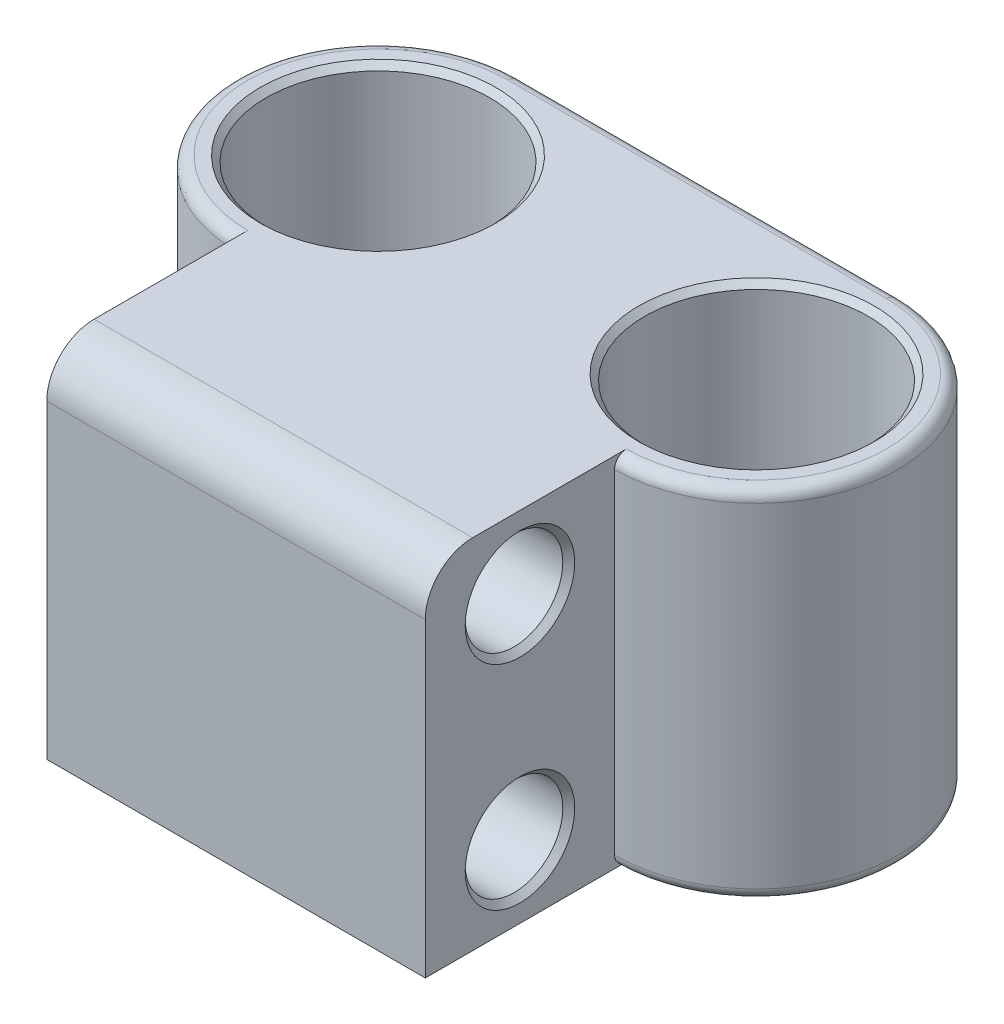
ISO-10303-21;
HEADER;
FILE_DESCRIPTION(('STEP AP214'),'2;1');
FILE_NAME('part.step','',(''),(''),'','','');
FILE_SCHEMA(('AUTOMOTIVE_DESIGN { 1 0 10303 214 1 1 1 1 }'));
ENDSEC;
DATA;
#1=APPLICATION_CONTEXT('core data for automotive mechanical design processes');
#2=APPLICATION_PROTOCOL_DEFINITION('international standard','automotive_design',2000,#1);
#3=PRODUCT_CONTEXT('',#1,'mechanical');
#4=PRODUCT('Part','Part','',(#3));
#5=PRODUCT_RELATED_PRODUCT_CATEGORY('part','',(#4));
#6=PRODUCT_DEFINITION_FORMATION('','',#4);
#7=PRODUCT_DEFINITION_CONTEXT('part definition',#1,'design');
#8=PRODUCT_DEFINITION('design','',#6,#7);
#9=PRODUCT_DEFINITION_SHAPE('','',#8);
#10=(LENGTH_UNIT() NAMED_UNIT(*) SI_UNIT(.MILLI.,.METRE.));
#11=(NAMED_UNIT(*) PLANE_ANGLE_UNIT() SI_UNIT($,.RADIAN.));
#12=(NAMED_UNIT(*) SI_UNIT($,.STERADIAN.) SOLID_ANGLE_UNIT());
#13=UNCERTAINTY_MEASURE_WITH_UNIT(LENGTH_MEASURE(1.E-05),#10,'distance_accuracy_value','');
#14=(GEOMETRIC_REPRESENTATION_CONTEXT(3) GLOBAL_UNCERTAINTY_ASSIGNED_CONTEXT((#13)) GLOBAL_UNIT_ASSIGNED_CONTEXT((#10,
#11,#12)) REPRESENTATION_CONTEXT('',''));
#15=CARTESIAN_POINT('',(0.,0.,0.));
#16=DIRECTION('',(0.,0.,1.));
#17=DIRECTION('',(1.,0.,0.));
#18=AXIS2_PLACEMENT_3D('',#15,#16,#17);
#19=CARTESIAN_POINT('',(-12.7,24.,-15.875));
#20=DIRECTION('',(0.,1.,0.));
#21=DIRECTION('',(0.,0.,1.));
#22=AXIS2_PLACEMENT_3D('',#19,#20,#21);
#23=PLANE('',#22);
#24=CARTESIAN_POINT('',(-12.7,24.,-15.875));
#25=DIRECTION('',(0.,1.,0.));
#26=DIRECTION('',(0.,0.,1.));
#27=AXIS2_PLACEMENT_3D('',#24,#25,#26);
#28=CIRCLE('',#27,7.90000000000001);
#29=CARTESIAN_POINT('',(-12.7,24.,-7.97499999999999));
#30=VERTEX_POINT('',#29);
#31=EDGE_CURVE('E180',#30,#30,#28,.F.);
#32=ORIENTED_EDGE('',*,*,#31,.T.);
#33=EDGE_LOOP('',(#32));
#34=FACE_BOUND('',#33,.T.);
#35=CARTESIAN_POINT('',(12.7,24.,-15.875));
#36=DIRECTION('',(0.,1.,0.));
#37=DIRECTION('',(0.,0.,1.));
#38=AXIS2_PLACEMENT_3D('',#35,#36,#37);
#39=CIRCLE('',#38,7.89999999999999);
#40=CARTESIAN_POINT('',(12.7,24.,-7.97500000000001));
#41=VERTEX_POINT('',#40);
#42=EDGE_CURVE('E177',#41,#41,#39,.F.);
#43=ORIENTED_EDGE('',*,*,#42,.T.);
#44=EDGE_LOOP('',(#43));
#45=FACE_BOUND('',#44,.T.);
#46=CARTESIAN_POINT('',(-12.7,24.,-15.875));
#47=DIRECTION('',(0.,1.,0.));
#48=DIRECTION('',(0.,0.,1.));
#49=AXIS2_PLACEMENT_3D('',#46,#47,#48);
#50=CIRCLE('',#49,8.73125);
#51=CARTESIAN_POINT('',(-12.7,24.,-24.60625));
#52=VERTEX_POINT('',#51);
#53=CARTESIAN_POINT('',(-12.7,24.,-7.14375));
#54=VERTEX_POINT('',#53);
#55=EDGE_CURVE('E219',#52,#54,#50,.T.);
#56=ORIENTED_EDGE('',*,*,#55,.T.);
#57=DIRECTION('',(0.,0.,1.));
#58=VECTOR('',#57,1.);
#59=CARTESIAN_POINT('',(-12.7,24.,6.35));
#60=LINE('',#59,#58);
#61=CARTESIAN_POINT('',(-12.7,24.,3.175));
#62=VERTEX_POINT('',#61);
#63=EDGE_CURVE('E144',#54,#62,#60,.T.);
#64=ORIENTED_EDGE('',*,*,#63,.T.);
#65=DIRECTION('',(1.,0.,0.));
#66=VECTOR('',#65,1.);
#67=CARTESIAN_POINT('',(12.7,24.,3.175));
#68=LINE('',#67,#66);
#69=CARTESIAN_POINT('',(12.7,24.,3.175));
#70=VERTEX_POINT('',#69);
#71=EDGE_CURVE('E183',#62,#70,#68,.T.);
#72=ORIENTED_EDGE('',*,*,#71,.T.);
#73=DIRECTION('',(0.,0.,-1.));
#74=VECTOR('',#73,1.);
#75=CARTESIAN_POINT('',(12.7,24.,6.35));
#76=LINE('',#75,#74);
#77=CARTESIAN_POINT('',(12.7,24.,-7.14375));
#78=VERTEX_POINT('',#77);
#79=EDGE_CURVE('E152',#70,#78,#76,.T.);
#80=ORIENTED_EDGE('',*,*,#79,.T.);
#81=CARTESIAN_POINT('',(12.7,24.,-15.875));
#82=DIRECTION('',(0.,1.,0.));
#83=DIRECTION('',(0.,0.,1.));
#84=AXIS2_PLACEMENT_3D('',#81,#82,#83);
#85=CIRCLE('',#84,8.73125);
#86=CARTESIAN_POINT('',(12.7,24.,-24.60625));
#87=VERTEX_POINT('',#86);
#88=EDGE_CURVE('E215',#78,#87,#85,.T.);
#89=ORIENTED_EDGE('',*,*,#88,.T.);
#90=DIRECTION('',(-1.,0.,0.));
#91=VECTOR('',#90,1.);
#92=CARTESIAN_POINT('',(-12.7,24.,-24.60625));
#93=LINE('',#92,#91);
#94=EDGE_CURVE('E217',#87,#52,#93,.T.);
#95=ORIENTED_EDGE('',*,*,#94,.T.);
#96=EDGE_LOOP('',(#56,#64,#72,#80,#89,#95));
#97=FACE_BOUND('',#96,.T.);
#98=ADVANCED_FACE('F33',(#34,#45,#97),#23,.T.);
#99=CARTESIAN_POINT('',(-12.7,0.,-15.875));
#100=DIRECTION('',(0.,1.,0.));
#101=DIRECTION('',(0.,0.,1.));
#102=AXIS2_PLACEMENT_3D('',#99,#100,#101);
#103=PLANE('',#102);
#104=CARTESIAN_POINT('',(12.7,0.,-15.875));
#105=DIRECTION('',(0.,1.,0.));
#106=DIRECTION('',(0.,0.,1.));
#107=AXIS2_PLACEMENT_3D('',#104,#105,#106);
#108=CIRCLE('',#107,7.89999999991048);
#109=CARTESIAN_POINT('',(12.7,0.,-7.97500000008953));
#110=VERTEX_POINT('',#109);
#111=EDGE_CURVE('E162',#110,#110,#108,.T.);
#112=ORIENTED_EDGE('',*,*,#111,.T.);
#113=EDGE_LOOP('',(#112));
#114=FACE_BOUND('',#113,.T.);
#115=CARTESIAN_POINT('',(-12.7,0.,-15.875));
#116=DIRECTION('',(0.,1.,0.));
#117=DIRECTION('',(0.,0.,1.));
#118=AXIS2_PLACEMENT_3D('',#115,#116,#117);
#119=CIRCLE('',#118,7.89999999991047);
#120=CARTESIAN_POINT('',(-12.7,0.,-7.97500000008953));
#121=VERTEX_POINT('',#120);
#122=EDGE_CURVE('E159',#121,#121,#119,.T.);
#123=ORIENTED_EDGE('',*,*,#122,.T.);
#124=EDGE_LOOP('',(#123));
#125=FACE_BOUND('',#124,.T.);
#126=DIRECTION('',(0.,0.,1.));
#127=VECTOR('',#126,1.);
#128=CARTESIAN_POINT('',(-12.7,0.,6.35));
#129=LINE('',#128,#127);
#130=CARTESIAN_POINT('',(-12.7,0.,-7.14375));
#131=VERTEX_POINT('',#130);
#132=CARTESIAN_POINT('',(-12.7,0.,6.35));
#133=VERTEX_POINT('',#132);
#134=EDGE_CURVE('E132',#131,#133,#129,.T.);
#135=ORIENTED_EDGE('',*,*,#134,.F.);
#136=CARTESIAN_POINT('',(-12.7,0.,-15.875));
#137=DIRECTION('',(0.,1.,0.));
#138=DIRECTION('',(0.,0.,1.));
#139=AXIS2_PLACEMENT_3D('',#136,#137,#138);
#140=CIRCLE('',#139,8.73125);
#141=CARTESIAN_POINT('',(-12.7,0.,-24.60625));
#142=VERTEX_POINT('',#141);
#143=EDGE_CURVE('E235',#131,#142,#140,.F.);
#144=ORIENTED_EDGE('',*,*,#143,.T.);
#145=DIRECTION('',(-1.,0.,0.));
#146=VECTOR('',#145,1.);
#147=CARTESIAN_POINT('',(-12.7,0.,-24.60625));
#148=LINE('',#147,#146);
#149=CARTESIAN_POINT('',(12.7,0.,-24.60625));
#150=VERTEX_POINT('',#149);
#151=EDGE_CURVE('E233',#142,#150,#148,.F.);
#152=ORIENTED_EDGE('',*,*,#151,.T.);
#153=CARTESIAN_POINT('',(12.7,0.,-15.875));
#154=DIRECTION('',(0.,1.,0.));
#155=DIRECTION('',(0.,0.,1.));
#156=AXIS2_PLACEMENT_3D('',#153,#154,#155);
#157=CIRCLE('',#156,8.73125);
#158=CARTESIAN_POINT('',(12.7,0.,-7.14375));
#159=VERTEX_POINT('',#158);
#160=EDGE_CURVE('E231',#150,#159,#157,.F.);
#161=ORIENTED_EDGE('',*,*,#160,.T.);
#162=DIRECTION('',(0.,0.,-1.));
#163=VECTOR('',#162,1.);
#164=CARTESIAN_POINT('',(12.7,0.,6.35));
#165=LINE('',#164,#163);
#166=CARTESIAN_POINT('',(12.7,0.,6.35));
#167=VERTEX_POINT('',#166);
#168=EDGE_CURVE('E142',#167,#159,#165,.T.);
#169=ORIENTED_EDGE('',*,*,#168,.F.);
#170=DIRECTION('',(1.,0.,0.));
#171=VECTOR('',#170,1.);
#172=CARTESIAN_POINT('',(12.7,0.,6.35));
#173=LINE('',#172,#171);
#174=EDGE_CURVE('E122',#133,#167,#173,.T.);
#175=ORIENTED_EDGE('',*,*,#174,.F.);
#176=EDGE_LOOP('',(#135,#144,#152,#161,#169,#175));
#177=FACE_BOUND('',#176,.T.);
#178=ADVANCED_FACE('F140',(#114,#125,#177),#103,.F.);
#179=CARTESIAN_POINT('',(-12.7,24.,-15.875));
#180=DIRECTION('',(0.,-1.,0.));
#181=DIRECTION('',(0.,0.,-1.));
#182=AXIS2_PLACEMENT_3D('',#179,#180,#181);
#183=CYLINDRICAL_SURFACE('',#182,9.525);
#184=DIRECTION('',(0.,-1.,0.));
#185=VECTOR('',#184,1.);
#186=CARTESIAN_POINT('',(-12.7,24.,-6.35));
#187=LINE('',#186,#185);
#188=CARTESIAN_POINT('',(-12.7,23.20625,-6.35));
#189=VERTEX_POINT('',#188);
#190=CARTESIAN_POINT('',(-12.7,0.793749999999999,-6.35));
#191=VERTEX_POINT('',#190);
#192=EDGE_CURVE('E128',#189,#191,#187,.T.);
#193=ORIENTED_EDGE('',*,*,#192,.F.);
#194=CARTESIAN_POINT('',(-12.7,23.20625,-15.875));
#195=DIRECTION('',(0.,1.,0.));
#196=DIRECTION('',(0.,0.,1.));
#197=AXIS2_PLACEMENT_3D('',#194,#195,#196);
#198=CIRCLE('',#197,9.525);
#199=CARTESIAN_POINT('',(-12.7,23.20625,-25.4));
#200=VERTEX_POINT('',#199);
#201=EDGE_CURVE('E225',#189,#200,#198,.F.);
#202=ORIENTED_EDGE('',*,*,#201,.T.);
#203=DIRECTION('',(0.,-1.,0.));
#204=VECTOR('',#203,1.);
#205=CARTESIAN_POINT('',(-12.7,24.,-25.4));
#206=LINE('',#205,#204);
#207=CARTESIAN_POINT('',(-12.7,0.793749999999999,-25.4));
#208=VERTEX_POINT('',#207);
#209=EDGE_CURVE('E148',#200,#208,#206,.T.);
#210=ORIENTED_EDGE('',*,*,#209,.T.);
#211=CARTESIAN_POINT('',(-12.7,0.793749999999999,-15.875));
#212=DIRECTION('',(0.,1.,0.));
#213=DIRECTION('',(0.,0.,1.));
#214=AXIS2_PLACEMENT_3D('',#211,#212,#213);
#215=CIRCLE('',#214,9.525);
#216=EDGE_CURVE('E222',#208,#191,#215,.T.);
#217=ORIENTED_EDGE('',*,*,#216,.T.);
#218=EDGE_LOOP('',(#193,#202,#210,#217));
#219=FACE_BOUND('',#218,.T.);
#220=ADVANCED_FACE('F266',(#219),#183,.T.);
#221=CARTESIAN_POINT('',(-12.7,24.,6.35));
#222=DIRECTION('',(1.,0.,0.));
#223=DIRECTION('',(0.,0.,-1.));
#224=AXIS2_PLACEMENT_3D('',#221,#222,#223);
#225=PLANE('',#224);
#226=CARTESIAN_POINT('',(-12.7,19.14375,0.));
#227=DIRECTION('',(1.,0.,0.));
#228=DIRECTION('',(0.,0.,-1.));
#229=AXIS2_PLACEMENT_3D('',#226,#227,#228);
#230=CIRCLE('',#229,3.67499999991047);
#231=CARTESIAN_POINT('',(-12.7,19.14375,-3.67499999991047));
#232=VERTEX_POINT('',#231);
#233=EDGE_CURVE('E212',#232,#232,#230,.T.);
#234=ORIENTED_EDGE('',*,*,#233,.T.);
#235=EDGE_LOOP('',(#234));
#236=FACE_BOUND('',#235,.T.);
#237=CARTESIAN_POINT('',(-12.7,4.85625,0.));
#238=DIRECTION('',(1.,0.,0.));
#239=DIRECTION('',(0.,0.,-1.));
#240=AXIS2_PLACEMENT_3D('',#237,#238,#239);
#241=CIRCLE('',#240,3.67499999991047);
#242=CARTESIAN_POINT('',(-12.7,4.85625,-3.67499999991047));
#243=VERTEX_POINT('',#242);
#244=EDGE_CURVE('E209',#243,#243,#241,.T.);
#245=ORIENTED_EDGE('',*,*,#244,.T.);
#246=EDGE_LOOP('',(#245));
#247=FACE_BOUND('',#246,.T.);
#248=DIRECTION('',(0.,-1.,0.));
#249=VECTOR('',#248,1.);
#250=CARTESIAN_POINT('',(-12.7,24.,6.35));
#251=LINE('',#250,#249);
#252=CARTESIAN_POINT('',(-12.7,20.825,6.35));
#253=VERTEX_POINT('',#252);
#254=EDGE_CURVE('E117',#253,#133,#251,.T.);
#255=ORIENTED_EDGE('',*,*,#254,.F.);
#256=CARTESIAN_POINT('',(-12.7,20.825,3.175));
#257=DIRECTION('',(1.,0.,0.));
#258=DIRECTION('',(0.,0.,-1.));
#259=AXIS2_PLACEMENT_3D('',#256,#257,#258);
#260=CIRCLE('',#259,3.175);
#261=EDGE_CURVE('E189',#253,#62,#260,.F.);
#262=ORIENTED_EDGE('',*,*,#261,.T.);
#263=ORIENTED_EDGE('',*,*,#63,.F.);
#264=CARTESIAN_POINT('',(-12.7,23.20625,-7.14375));
#265=DIRECTION('',(1.,0.,0.));
#266=DIRECTION('',(0.,0.,-1.));
#267=AXIS2_PLACEMENT_3D('',#264,#265,#266);
#268=CIRCLE('',#267,0.79375);
#269=EDGE_CURVE('E240',#54,#189,#268,.T.);
#270=ORIENTED_EDGE('',*,*,#269,.T.);
#271=ORIENTED_EDGE('',*,*,#192,.T.);
#272=CARTESIAN_POINT('',(-12.7,0.793749999999999,-7.14375));
#273=DIRECTION('',(1.,0.,0.));
#274=DIRECTION('',(0.,0.,-1.));
#275=AXIS2_PLACEMENT_3D('',#272,#273,#274);
#276=CIRCLE('',#275,0.79375);
#277=EDGE_CURVE('E135',#191,#131,#276,.T.);
#278=ORIENTED_EDGE('',*,*,#277,.T.);
#279=ORIENTED_EDGE('',*,*,#134,.T.);
#280=EDGE_LOOP('',(#255,#262,#263,#270,#271,#278,#279));
#281=FACE_BOUND('',#280,.T.);
#282=ADVANCED_FACE('F133',(#236,#247,#281),#225,.F.);
#283=CARTESIAN_POINT('',(12.7,24.,6.35));
#284=DIRECTION('',(0.,0.,-1.));
#285=DIRECTION('',(-1.,0.,0.));
#286=AXIS2_PLACEMENT_3D('',#283,#284,#285);
#287=PLANE('',#286);
#288=DIRECTION('',(0.,-1.,0.));
#289=VECTOR('',#288,1.);
#290=CARTESIAN_POINT('',(12.7,24.,6.35));
#291=LINE('',#290,#289);
#292=CARTESIAN_POINT('',(12.7,20.825,6.35));
#293=VERTEX_POINT('',#292);
#294=EDGE_CURVE('E129',#293,#167,#291,.T.);
#295=ORIENTED_EDGE('',*,*,#294,.F.);
#296=DIRECTION('',(1.,0.,0.));
#297=VECTOR('',#296,1.);
#298=CARTESIAN_POINT('',(-12.7,20.825,6.35));
#299=LINE('',#298,#297);
#300=EDGE_CURVE('E125',#293,#253,#299,.F.);
#301=ORIENTED_EDGE('',*,*,#300,.T.);
#302=ORIENTED_EDGE('',*,*,#254,.T.);
#303=ORIENTED_EDGE('',*,*,#174,.T.);
#304=EDGE_LOOP('',(#295,#301,#302,#303));
#305=FACE_BOUND('',#304,.T.);
#306=ADVANCED_FACE('F120',(#305),#287,.F.);
#307=CARTESIAN_POINT('',(12.7,24.,6.35));
#308=DIRECTION('',(-1.,0.,0.));
#309=DIRECTION('',(0.,0.,1.));
#310=AXIS2_PLACEMENT_3D('',#307,#308,#309);
#311=PLANE('',#310);
#312=CARTESIAN_POINT('',(12.7,4.85625,0.));
#313=DIRECTION('',(-1.,0.,0.));
#314=DIRECTION('',(0.,0.,1.));
#315=AXIS2_PLACEMENT_3D('',#312,#313,#314);
#316=CIRCLE('',#315,3.67499999999999);
#317=CARTESIAN_POINT('',(12.7,4.85625,3.67499999999999));
#318=VERTEX_POINT('',#317);
#319=EDGE_CURVE('E200',#318,#318,#316,.T.);
#320=ORIENTED_EDGE('',*,*,#319,.T.);
#321=EDGE_LOOP('',(#320));
#322=FACE_BOUND('',#321,.T.);
#323=CARTESIAN_POINT('',(12.7,19.14375,0.));
#324=DIRECTION('',(-1.,0.,0.));
#325=DIRECTION('',(0.,0.,1.));
#326=AXIS2_PLACEMENT_3D('',#323,#324,#325);
#327=CIRCLE('',#326,3.67499999999999);
#328=CARTESIAN_POINT('',(12.7,19.14375,3.67499999999999));
#329=VERTEX_POINT('',#328);
#330=EDGE_CURVE('E197',#329,#329,#327,.T.);
#331=ORIENTED_EDGE('',*,*,#330,.T.);
#332=EDGE_LOOP('',(#331));
#333=FACE_BOUND('',#332,.T.);
#334=ORIENTED_EDGE('',*,*,#79,.F.);
#335=CARTESIAN_POINT('',(12.7,20.825,3.175));
#336=DIRECTION('',(-1.,0.,0.));
#337=DIRECTION('',(0.,0.,1.));
#338=AXIS2_PLACEMENT_3D('',#335,#336,#337);
#339=CIRCLE('',#338,3.175);
#340=EDGE_CURVE('E186',#70,#293,#339,.F.);
#341=ORIENTED_EDGE('',*,*,#340,.T.);
#342=ORIENTED_EDGE('',*,*,#294,.T.);
#343=ORIENTED_EDGE('',*,*,#168,.T.);
#344=CARTESIAN_POINT('',(12.7,0.793749999999999,-7.14375));
#345=DIRECTION('',(-1.,0.,0.));
#346=DIRECTION('',(0.,0.,1.));
#347=AXIS2_PLACEMENT_3D('',#344,#345,#346);
#348=CIRCLE('',#347,0.79375);
#349=CARTESIAN_POINT('',(12.7,0.793749999999999,-6.35));
#350=VERTEX_POINT('',#349);
#351=EDGE_CURVE('E11',#159,#350,#348,.T.);
#352=ORIENTED_EDGE('',*,*,#351,.T.);
#353=DIRECTION('',(0.,-1.,0.));
#354=VECTOR('',#353,1.);
#355=CARTESIAN_POINT('',(12.7,24.,-6.35));
#356=LINE('',#355,#354);
#357=CARTESIAN_POINT('',(12.7,23.20625,-6.35));
#358=VERTEX_POINT('',#357);
#359=EDGE_CURVE('E155',#358,#350,#356,.T.);
#360=ORIENTED_EDGE('',*,*,#359,.F.);
#361=CARTESIAN_POINT('',(12.7,23.20625,-7.14375));
#362=DIRECTION('',(-1.,0.,0.));
#363=DIRECTION('',(0.,0.,1.));
#364=AXIS2_PLACEMENT_3D('',#361,#362,#363);
#365=CIRCLE('',#364,0.79375);
#366=EDGE_CURVE('E42',#358,#78,#365,.T.);
#367=ORIENTED_EDGE('',*,*,#366,.T.);
#368=EDGE_LOOP('',(#334,#341,#342,#343,#352,#360,#367));
#369=FACE_BOUND('',#368,.T.);
#370=ADVANCED_FACE('F290',(#322,#333,#369),#311,.F.);
#371=CARTESIAN_POINT('',(12.7,24.,-15.875));
#372=DIRECTION('',(0.,-1.,0.));
#373=DIRECTION('',(0.,0.,-1.));
#374=AXIS2_PLACEMENT_3D('',#371,#372,#373);
#375=CYLINDRICAL_SURFACE('',#374,9.525);
#376=DIRECTION('',(0.,-1.,0.));
#377=VECTOR('',#376,1.);
#378=CARTESIAN_POINT('',(12.7,24.,-25.4));
#379=LINE('',#378,#377);
#380=CARTESIAN_POINT('',(12.7,23.20625,-25.4));
#381=VERTEX_POINT('',#380);
#382=CARTESIAN_POINT('',(12.7,0.793749999999999,-25.4));
#383=VERTEX_POINT('',#382);
#384=EDGE_CURVE('E151',#381,#383,#379,.T.);
#385=ORIENTED_EDGE('',*,*,#384,.F.);
#386=CARTESIAN_POINT('',(12.7,23.20625,-15.875));
#387=DIRECTION('',(0.,1.,0.));
#388=DIRECTION('',(0.,0.,1.));
#389=AXIS2_PLACEMENT_3D('',#386,#387,#388);
#390=CIRCLE('',#389,9.525);
#391=EDGE_CURVE('E55',#381,#358,#390,.F.);
#392=ORIENTED_EDGE('',*,*,#391,.T.);
#393=ORIENTED_EDGE('',*,*,#359,.T.);
#394=CARTESIAN_POINT('',(12.7,0.793749999999999,-15.875));
#395=DIRECTION('',(0.,1.,0.));
#396=DIRECTION('',(0.,0.,1.));
#397=AXIS2_PLACEMENT_3D('',#394,#395,#396);
#398=CIRCLE('',#397,9.525);
#399=EDGE_CURVE('E237',#350,#383,#398,.T.);
#400=ORIENTED_EDGE('',*,*,#399,.T.);
#401=EDGE_LOOP('',(#385,#392,#393,#400));
#402=FACE_BOUND('',#401,.T.);
#403=ADVANCED_FACE('F285',(#402),#375,.T.);
#404=CARTESIAN_POINT('',(12.7,24.,-25.4));
#405=DIRECTION('',(0.,0.,1.));
#406=DIRECTION('',(1.,0.,0.));
#407=AXIS2_PLACEMENT_3D('',#404,#405,#406);
#408=PLANE('',#407);
#409=ORIENTED_EDGE('',*,*,#209,.F.);
#410=DIRECTION('',(-1.,0.,0.));
#411=VECTOR('',#410,1.);
#412=CARTESIAN_POINT('',(12.7,23.20625,-25.4));
#413=LINE('',#412,#411);
#414=EDGE_CURVE('E229',#200,#381,#413,.F.);
#415=ORIENTED_EDGE('',*,*,#414,.T.);
#416=ORIENTED_EDGE('',*,*,#384,.T.);
#417=DIRECTION('',(-1.,0.,0.));
#418=VECTOR('',#417,1.);
#419=CARTESIAN_POINT('',(12.7,0.793749999999999,-25.4));
#420=LINE('',#419,#418);
#421=EDGE_CURVE('E227',#383,#208,#420,.T.);
#422=ORIENTED_EDGE('',*,*,#421,.T.);
#423=EDGE_LOOP('',(#409,#415,#416,#422));
#424=FACE_BOUND('',#423,.T.);
#425=ADVANCED_FACE('F284',(#424),#408,.F.);
#426=CARTESIAN_POINT('',(-12.7,24.,-15.875));
#427=DIRECTION('',(0.,-1.,0.));
#428=DIRECTION('',(0.,0.,-1.));
#429=AXIS2_PLACEMENT_3D('',#426,#427,#428);
#430=CYLINDRICAL_SURFACE('',#429,7.5);
#431=CARTESIAN_POINT('',(-12.7,0.399999999999991,-15.875));
#432=DIRECTION('',(0.,1.,0.));
#433=DIRECTION('',(0.,0.,1.));
#434=AXIS2_PLACEMENT_3D('',#431,#432,#433);
#435=CIRCLE('',#434,7.5);
#436=CARTESIAN_POINT('',(-12.7,0.399999999999991,-8.375));
#437=VERTEX_POINT('',#436);
#438=EDGE_CURVE('E174',#437,#437,#435,.F.);
#439=ORIENTED_EDGE('',*,*,#438,.T.);
#440=EDGE_LOOP('',(#439));
#441=FACE_BOUND('',#440,.T.);
#442=CARTESIAN_POINT('',(-12.7,23.6000000000895,-15.875));
#443=DIRECTION('',(0.,1.,0.));
#444=DIRECTION('',(0.,0.,1.));
#445=AXIS2_PLACEMENT_3D('',#442,#443,#444);
#446=CIRCLE('',#445,7.5);
#447=CARTESIAN_POINT('',(-12.7,23.6000000000895,-8.375));
#448=VERTEX_POINT('',#447);
#449=EDGE_CURVE('E171',#448,#448,#446,.T.);
#450=ORIENTED_EDGE('',*,*,#449,.T.);
#451=EDGE_LOOP('',(#450));
#452=FACE_BOUND('',#451,.T.);
#453=ADVANCED_FACE('F319',(#441,#452),#430,.F.);
#454=CARTESIAN_POINT('',(12.7,24.,-15.875));
#455=DIRECTION('',(0.,-1.,0.));
#456=DIRECTION('',(0.,0.,-1.));
#457=AXIS2_PLACEMENT_3D('',#454,#455,#456);
#458=CYLINDRICAL_SURFACE('',#457,7.5);
#459=CARTESIAN_POINT('',(12.7,0.400000000000008,-15.875));
#460=DIRECTION('',(0.,1.,0.));
#461=DIRECTION('',(0.,0.,1.));
#462=AXIS2_PLACEMENT_3D('',#459,#460,#461);
#463=CIRCLE('',#462,7.5);
#464=CARTESIAN_POINT('',(12.7,0.400000000000008,-8.375));
#465=VERTEX_POINT('',#464);
#466=EDGE_CURVE('E168',#465,#465,#463,.F.);
#467=ORIENTED_EDGE('',*,*,#466,.T.);
#468=EDGE_LOOP('',(#467));
#469=FACE_BOUND('',#468,.T.);
#470=CARTESIAN_POINT('',(12.7,23.6000000000895,-15.875));
#471=DIRECTION('',(0.,1.,0.));
#472=DIRECTION('',(0.,0.,1.));
#473=AXIS2_PLACEMENT_3D('',#470,#471,#472);
#474=CIRCLE('',#473,7.5);
#475=CARTESIAN_POINT('',(12.7,23.6000000000895,-8.375));
#476=VERTEX_POINT('',#475);
#477=EDGE_CURVE('E165',#476,#476,#474,.T.);
#478=ORIENTED_EDGE('',*,*,#477,.T.);
#479=EDGE_LOOP('',(#478));
#480=FACE_BOUND('',#479,.T.);
#481=ADVANCED_FACE('F340',(#469,#480),#458,.F.);
#482=CARTESIAN_POINT('',(12.7,0.,-15.875));
#483=DIRECTION('',(0.,-1.,0.));
#484=DIRECTION('',(0.,0.,-1.));
#485=AXIS2_PLACEMENT_3D('',#482,#483,#484);
#486=CONICAL_SURFACE('',#485,7.89999999991048,0.785398163285538);
#487=ORIENTED_EDGE('',*,*,#466,.F.);
#488=EDGE_LOOP('',(#487));
#489=FACE_BOUND('',#488,.T.);
#490=ORIENTED_EDGE('',*,*,#111,.F.);
#491=EDGE_LOOP('',(#490));
#492=FACE_BOUND('',#491,.T.);
#493=ADVANCED_FACE('F336',(#489,#492),#486,.F.);
#494=CARTESIAN_POINT('',(-12.7,0.,-15.875));
#495=DIRECTION('',(0.,-1.,0.));
#496=DIRECTION('',(0.,0.,-1.));
#497=AXIS2_PLACEMENT_3D('',#494,#495,#496);
#498=CONICAL_SURFACE('',#497,7.89999999991047,0.78539816328555);
#499=ORIENTED_EDGE('',*,*,#438,.F.);
#500=EDGE_LOOP('',(#499));
#501=FACE_BOUND('',#500,.T.);
#502=ORIENTED_EDGE('',*,*,#122,.F.);
#503=EDGE_LOOP('',(#502));
#504=FACE_BOUND('',#503,.T.);
#505=ADVANCED_FACE('F339',(#501,#504),#498,.F.);
#506=CARTESIAN_POINT('',(-12.7,23.6000000000895,-15.875));
#507=DIRECTION('',(0.,1.,0.));
#508=DIRECTION('',(0.,0.,1.));
#509=AXIS2_PLACEMENT_3D('',#506,#507,#508);
#510=CONICAL_SURFACE('',#509,7.5,0.785398163509347);
#511=ORIENTED_EDGE('',*,*,#31,.F.);
#512=EDGE_LOOP('',(#511));
#513=FACE_BOUND('',#512,.T.);
#514=ORIENTED_EDGE('',*,*,#449,.F.);
#515=EDGE_LOOP('',(#514));
#516=FACE_BOUND('',#515,.T.);
#517=ADVANCED_FACE('F305',(#513,#516),#510,.F.);
#518=CARTESIAN_POINT('',(12.7,23.6000000000895,-15.875));
#519=DIRECTION('',(0.,1.,0.));
#520=DIRECTION('',(0.,0.,1.));
#521=AXIS2_PLACEMENT_3D('',#518,#519,#520);
#522=CONICAL_SURFACE('',#521,7.5,0.785398163509343);
#523=ORIENTED_EDGE('',*,*,#42,.F.);
#524=EDGE_LOOP('',(#523));
#525=FACE_BOUND('',#524,.T.);
#526=ORIENTED_EDGE('',*,*,#477,.F.);
#527=EDGE_LOOP('',(#526));
#528=FACE_BOUND('',#527,.T.);
#529=ADVANCED_FACE('F296',(#525,#528),#522,.F.);
#530=CARTESIAN_POINT('',(-12.7,20.825,3.175));
#531=DIRECTION('',(-1.,0.,0.));
#532=DIRECTION('',(0.,0.,1.));
#533=AXIS2_PLACEMENT_3D('',#530,#531,#532);
#534=CYLINDRICAL_SURFACE('',#533,3.175);
#535=ORIENTED_EDGE('',*,*,#261,.F.);
#536=ORIENTED_EDGE('',*,*,#300,.F.);
#537=ORIENTED_EDGE('',*,*,#340,.F.);
#538=ORIENTED_EDGE('',*,*,#71,.F.);
#539=EDGE_LOOP('',(#535,#536,#537,#538));
#540=FACE_BOUND('',#539,.T.);
#541=ADVANCED_FACE('F293',(#540),#534,.T.);
#542=CARTESIAN_POINT('',(-22.225,19.14375,0.));
#543=DIRECTION('',(1.,0.,0.));
#544=DIRECTION('',(0.,0.,-1.));
#545=AXIS2_PLACEMENT_3D('',#542,#543,#544);
#546=CYLINDRICAL_SURFACE('',#545,3.275);
#547=CARTESIAN_POINT('',(12.3000000000895,19.14375,0.));
#548=DIRECTION('',(-1.,0.,0.));
#549=DIRECTION('',(0.,0.,1.));
#550=AXIS2_PLACEMENT_3D('',#547,#548,#549);
#551=CIRCLE('',#550,3.275);
#552=CARTESIAN_POINT('',(12.3000000000895,19.14375,3.275));
#553=VERTEX_POINT('',#552);
#554=EDGE_CURVE('E206',#553,#553,#551,.F.);
#555=ORIENTED_EDGE('',*,*,#554,.T.);
#556=EDGE_LOOP('',(#555));
#557=FACE_BOUND('',#556,.T.);
#558=CARTESIAN_POINT('',(-12.3,19.14375,0.));
#559=DIRECTION('',(1.,0.,0.));
#560=DIRECTION('',(0.,0.,-1.));
#561=AXIS2_PLACEMENT_3D('',#558,#559,#560);
#562=CIRCLE('',#561,3.275);
#563=CARTESIAN_POINT('',(-12.3,19.14375,-3.275));
#564=VERTEX_POINT('',#563);
#565=EDGE_CURVE('E203',#564,#564,#562,.F.);
#566=ORIENTED_EDGE('',*,*,#565,.T.);
#567=EDGE_LOOP('',(#566));
#568=FACE_BOUND('',#567,.T.);
#569=ADVANCED_FACE('F295',(#557,#568),#546,.F.);
#570=CARTESIAN_POINT('',(-22.225,4.85625,0.));
#571=DIRECTION('',(1.,0.,0.));
#572=DIRECTION('',(0.,0.,-1.));
#573=AXIS2_PLACEMENT_3D('',#570,#571,#572);
#574=CYLINDRICAL_SURFACE('',#573,3.275);
#575=CARTESIAN_POINT('',(12.3000000000895,4.85625,0.));
#576=DIRECTION('',(-1.,0.,0.));
#577=DIRECTION('',(0.,0.,1.));
#578=AXIS2_PLACEMENT_3D('',#575,#576,#577);
#579=CIRCLE('',#578,3.275);
#580=CARTESIAN_POINT('',(12.3000000000895,4.85625,3.275));
#581=VERTEX_POINT('',#580);
#582=EDGE_CURVE('E194',#581,#581,#579,.F.);
#583=ORIENTED_EDGE('',*,*,#582,.T.);
#584=EDGE_LOOP('',(#583));
#585=FACE_BOUND('',#584,.T.);
#586=CARTESIAN_POINT('',(-12.3,4.85625,0.));
#587=DIRECTION('',(1.,0.,0.));
#588=DIRECTION('',(0.,0.,-1.));
#589=AXIS2_PLACEMENT_3D('',#586,#587,#588);
#590=CIRCLE('',#589,3.275);
#591=CARTESIAN_POINT('',(-12.3,4.85625,-3.275));
#592=VERTEX_POINT('',#591);
#593=EDGE_CURVE('E191',#592,#592,#590,.F.);
#594=ORIENTED_EDGE('',*,*,#593,.T.);
#595=EDGE_LOOP('',(#594));
#596=FACE_BOUND('',#595,.T.);
#597=ADVANCED_FACE('F302',(#585,#596),#574,.F.);
#598=CARTESIAN_POINT('',(12.3000000000895,4.85625,0.));
#599=DIRECTION('',(1.,0.,0.));
#600=DIRECTION('',(0.,0.,-1.));
#601=AXIS2_PLACEMENT_3D('',#598,#599,#600);
#602=CONICAL_SURFACE('',#601,3.275,0.785398163509356);
#603=ORIENTED_EDGE('',*,*,#319,.F.);
#604=EDGE_LOOP('',(#603));
#605=FACE_BOUND('',#604,.T.);
#606=ORIENTED_EDGE('',*,*,#582,.F.);
#607=EDGE_LOOP('',(#606));
#608=FACE_BOUND('',#607,.T.);
#609=ADVANCED_FACE('F368',(#605,#608),#602,.F.);
#610=CARTESIAN_POINT('',(12.3000000000895,19.14375,0.));
#611=DIRECTION('',(1.,0.,0.));
#612=DIRECTION('',(0.,0.,-1.));
#613=AXIS2_PLACEMENT_3D('',#610,#611,#612);
#614=CONICAL_SURFACE('',#613,3.275,0.785398163509356);
#615=ORIENTED_EDGE('',*,*,#330,.F.);
#616=EDGE_LOOP('',(#615));
#617=FACE_BOUND('',#616,.T.);
#618=ORIENTED_EDGE('',*,*,#554,.F.);
#619=EDGE_LOOP('',(#618));
#620=FACE_BOUND('',#619,.T.);
#621=ADVANCED_FACE('F373',(#617,#620),#614,.F.);
#622=CARTESIAN_POINT('',(-12.7,19.14375,0.));
#623=DIRECTION('',(-1.,0.,0.));
#624=DIRECTION('',(0.,0.,1.));
#625=AXIS2_PLACEMENT_3D('',#622,#623,#624);
#626=CONICAL_SURFACE('',#625,3.67499999991047,0.785398163285545);
#627=ORIENTED_EDGE('',*,*,#565,.F.);
#628=EDGE_LOOP('',(#627));
#629=FACE_BOUND('',#628,.T.);
#630=ORIENTED_EDGE('',*,*,#233,.F.);
#631=EDGE_LOOP('',(#630));
#632=FACE_BOUND('',#631,.T.);
#633=ADVANCED_FACE('F382',(#629,#632),#626,.F.);
#634=CARTESIAN_POINT('',(-12.7,4.85625,0.));
#635=DIRECTION('',(-1.,0.,0.));
#636=DIRECTION('',(0.,0.,1.));
#637=AXIS2_PLACEMENT_3D('',#634,#635,#636);
#638=CONICAL_SURFACE('',#637,3.67499999991047,0.785398163285545);
#639=ORIENTED_EDGE('',*,*,#593,.F.);
#640=EDGE_LOOP('',(#639));
#641=FACE_BOUND('',#640,.T.);
#642=ORIENTED_EDGE('',*,*,#244,.F.);
#643=EDGE_LOOP('',(#642));
#644=FACE_BOUND('',#643,.T.);
#645=ADVANCED_FACE('F379',(#641,#644),#638,.F.);
#646=CARTESIAN_POINT('',(12.7,23.20625,-15.875));
#647=DIRECTION('',(0.,1.,0.));
#648=DIRECTION('',(0.,0.,1.));
#649=AXIS2_PLACEMENT_3D('',#646,#647,#648);
#650=TOROIDAL_SURFACE('',#649,8.73125,0.79375);
#651=ORIENTED_EDGE('',*,*,#366,.F.);
#652=ORIENTED_EDGE('',*,*,#391,.F.);
#653=CARTESIAN_POINT('',(12.7,23.20625,-24.60625));
#654=DIRECTION('',(-1.,0.,0.));
#655=DIRECTION('',(0.,0.,1.));
#656=AXIS2_PLACEMENT_3D('',#653,#654,#655);
#657=CIRCLE('',#656,0.79375);
#658=EDGE_CURVE('E138',#87,#381,#657,.T.);
#659=ORIENTED_EDGE('',*,*,#658,.F.);
#660=ORIENTED_EDGE('',*,*,#88,.F.);
#661=EDGE_LOOP('',(#651,#652,#659,#660));
#662=FACE_BOUND('',#661,.T.);
#663=ADVANCED_FACE('F288',(#662),#650,.T.);
#664=CARTESIAN_POINT('',(-12.7,23.20625,-24.60625));
#665=DIRECTION('',(1.,0.,0.));
#666=DIRECTION('',(0.,0.,-1.));
#667=AXIS2_PLACEMENT_3D('',#664,#665,#666);
#668=CYLINDRICAL_SURFACE('',#667,0.79375);
#669=ORIENTED_EDGE('',*,*,#658,.T.);
#670=ORIENTED_EDGE('',*,*,#414,.F.);
#671=CARTESIAN_POINT('',(-12.7,23.20625,-24.60625));
#672=DIRECTION('',(-1.,0.,0.));
#673=DIRECTION('',(0.,0.,1.));
#674=AXIS2_PLACEMENT_3D('',#671,#672,#673);
#675=CIRCLE('',#674,0.79375);
#676=EDGE_CURVE('E245',#52,#200,#675,.T.);
#677=ORIENTED_EDGE('',*,*,#676,.F.);
#678=ORIENTED_EDGE('',*,*,#94,.F.);
#679=EDGE_LOOP('',(#669,#670,#677,#678));
#680=FACE_BOUND('',#679,.T.);
#681=ADVANCED_FACE('F282',(#680),#668,.T.);
#682=CARTESIAN_POINT('',(-12.7,23.20625,-15.875));
#683=DIRECTION('',(0.,1.,0.));
#684=DIRECTION('',(0.,0.,1.));
#685=AXIS2_PLACEMENT_3D('',#682,#683,#684);
#686=TOROIDAL_SURFACE('',#685,8.73125,0.79375);
#687=ORIENTED_EDGE('',*,*,#676,.T.);
#688=ORIENTED_EDGE('',*,*,#201,.F.);
#689=ORIENTED_EDGE('',*,*,#269,.F.);
#690=ORIENTED_EDGE('',*,*,#55,.F.);
#691=EDGE_LOOP('',(#687,#688,#689,#690));
#692=FACE_BOUND('',#691,.T.);
#693=ADVANCED_FACE('F273',(#692),#686,.T.);
#694=CARTESIAN_POINT('',(12.7,0.793749999999999,-15.875));
#695=DIRECTION('',(0.,1.,0.));
#696=DIRECTION('',(0.,0.,1.));
#697=AXIS2_PLACEMENT_3D('',#694,#695,#696);
#698=TOROIDAL_SURFACE('',#697,8.73125,0.79375);
#699=ORIENTED_EDGE('',*,*,#351,.F.);
#700=ORIENTED_EDGE('',*,*,#160,.F.);
#701=CARTESIAN_POINT('',(12.7,0.793749999999999,-24.60625));
#702=DIRECTION('',(-1.,0.,0.));
#703=DIRECTION('',(0.,0.,1.));
#704=AXIS2_PLACEMENT_3D('',#701,#702,#703);
#705=CIRCLE('',#704,0.79375);
#706=EDGE_CURVE('E37',#383,#150,#705,.T.);
#707=ORIENTED_EDGE('',*,*,#706,.F.);
#708=ORIENTED_EDGE('',*,*,#399,.F.);
#709=EDGE_LOOP('',(#699,#700,#707,#708));
#710=FACE_BOUND('',#709,.T.);
#711=ADVANCED_FACE('F35',(#710),#698,.T.);
#712=CARTESIAN_POINT('',(12.7,0.793749999999999,-24.60625));
#713=DIRECTION('',(-1.,0.,0.));
#714=DIRECTION('',(0.,0.,1.));
#715=AXIS2_PLACEMENT_3D('',#712,#713,#714);
#716=CYLINDRICAL_SURFACE('',#715,0.79375);
#717=ORIENTED_EDGE('',*,*,#706,.T.);
#718=ORIENTED_EDGE('',*,*,#151,.F.);
#719=CARTESIAN_POINT('',(-12.7,0.793749999999999,-24.60625));
#720=DIRECTION('',(-1.,0.,0.));
#721=DIRECTION('',(0.,0.,1.));
#722=AXIS2_PLACEMENT_3D('',#719,#720,#721);
#723=CIRCLE('',#722,0.79375);
#724=EDGE_CURVE('E249',#208,#142,#723,.T.);
#725=ORIENTED_EDGE('',*,*,#724,.F.);
#726=ORIENTED_EDGE('',*,*,#421,.F.);
#727=EDGE_LOOP('',(#717,#718,#725,#726));
#728=FACE_BOUND('',#727,.T.);
#729=ADVANCED_FACE('F259',(#728),#716,.T.);
#730=CARTESIAN_POINT('',(-12.7,0.793749999999999,-15.875));
#731=DIRECTION('',(0.,1.,0.));
#732=DIRECTION('',(0.,0.,1.));
#733=AXIS2_PLACEMENT_3D('',#730,#731,#732);
#734=TOROIDAL_SURFACE('',#733,8.73125,0.79375);
#735=ORIENTED_EDGE('',*,*,#724,.T.);
#736=ORIENTED_EDGE('',*,*,#143,.F.);
#737=ORIENTED_EDGE('',*,*,#277,.F.);
#738=ORIENTED_EDGE('',*,*,#216,.F.);
#739=EDGE_LOOP('',(#735,#736,#737,#738));
#740=FACE_BOUND('',#739,.T.);
#741=ADVANCED_FACE('F263',(#740),#734,.T.);
#742=CLOSED_SHELL('',(#98,#178,#220,#282,#306,#370,#403,#425,#453,#481,#493,#505,#517,#529,#541,
#569,#597,#609,#621,#633,#645,#663,#681,#693,#711,#729,#741));
#743=MANIFOLD_SOLID_BREP('B2',#742);
#744=ADVANCED_BREP_SHAPE_REPRESENTATION('',(#18,#743),#14);
#745=SHAPE_DEFINITION_REPRESENTATION(#9,#744);
ENDSEC;
END-ISO-10303-21;
